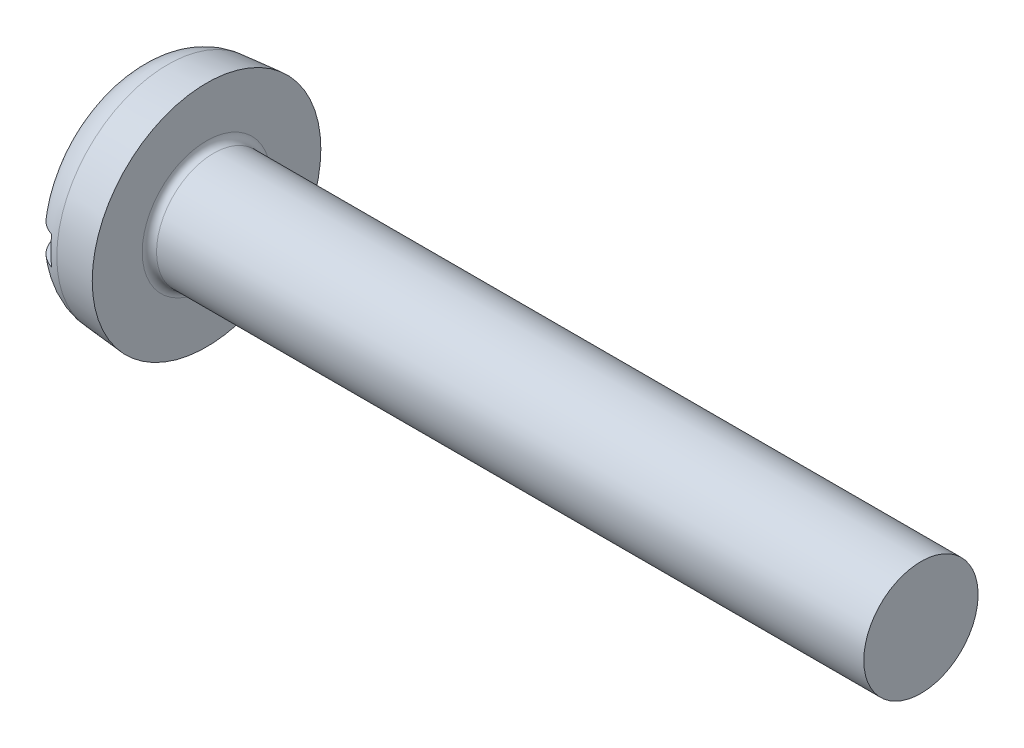
ISO-10303-21;
HEADER;
FILE_DESCRIPTION(('STEP AP214'),'2;1');
FILE_NAME('part.step','',(''),(''),'','','');
FILE_SCHEMA(('AUTOMOTIVE_DESIGN { 1 0 10303 214 1 1 1 1 }'));
ENDSEC;
DATA;
#1=APPLICATION_CONTEXT('core data for automotive mechanical design processes');
#2=APPLICATION_PROTOCOL_DEFINITION('international standard','automotive_design',2000,#1);
#3=PRODUCT_CONTEXT('',#1,'mechanical');
#4=PRODUCT('Part','Part','',(#3));
#5=PRODUCT_RELATED_PRODUCT_CATEGORY('part','',(#4));
#6=PRODUCT_DEFINITION_FORMATION('','',#4);
#7=PRODUCT_DEFINITION_CONTEXT('part definition',#1,'design');
#8=PRODUCT_DEFINITION('design','',#6,#7);
#9=PRODUCT_DEFINITION_SHAPE('','',#8);
#10=(LENGTH_UNIT() NAMED_UNIT(*) SI_UNIT(.MILLI.,.METRE.));
#11=(NAMED_UNIT(*) PLANE_ANGLE_UNIT() SI_UNIT($,.RADIAN.));
#12=(NAMED_UNIT(*) SI_UNIT($,.STERADIAN.) SOLID_ANGLE_UNIT());
#13=UNCERTAINTY_MEASURE_WITH_UNIT(LENGTH_MEASURE(1.E-05),#10,'distance_accuracy_value','');
#14=(GEOMETRIC_REPRESENTATION_CONTEXT(3) GLOBAL_UNCERTAINTY_ASSIGNED_CONTEXT((#13)) GLOBAL_UNIT_ASSIGNED_CONTEXT((#10,
#11,#12)) REPRESENTATION_CONTEXT('',''));
#15=CARTESIAN_POINT('',(0.,0.,0.));
#16=DIRECTION('',(0.,0.,1.));
#17=DIRECTION('',(1.,0.,0.));
#18=AXIS2_PLACEMENT_3D('',#15,#16,#17);
#19=CARTESIAN_POINT('',(0.,0.,0.));
#20=DIRECTION('',(1.,0.,0.));
#21=DIRECTION('',(0.,0.,-1.));
#22=AXIS2_PLACEMENT_3D('',#19,#20,#21);
#23=PLANE('',#22);
#24=DIRECTION('',(0.,0.,-1.));
#25=VECTOR('',#24,1.);
#26=CARTESIAN_POINT('',(0.,-0.2,1.6));
#27=LINE('',#26,#25);
#28=CARTESIAN_POINT('',(0.,-0.2,1.03520285906468));
#29=VERTEX_POINT('',#28);
#30=CARTESIAN_POINT('',(0.,-0.2,-1.03520285906468));
#31=VERTEX_POINT('',#30);
#32=EDGE_CURVE('E88',#29,#31,#27,.T.);
#33=ORIENTED_EDGE('',*,*,#32,.T.);
#34=CARTESIAN_POINT('',(0.,0.,0.));
#35=DIRECTION('',(1.,0.,0.));
#36=DIRECTION('',(0.,0.,-1.));
#37=AXIS2_PLACEMENT_3D('',#34,#35,#36);
#38=CIRCLE('',#37,1.05434574946537);
#39=EDGE_CURVE('E97',#31,#29,#38,.F.);
#40=ORIENTED_EDGE('',*,*,#39,.T.);
#41=EDGE_LOOP('',(#33,#40));
#42=FACE_BOUND('',#41,.T.);
#43=ADVANCED_FACE('F34',(#42),#23,.F.);
#44=DIRECTION('',(0.,0.,1.));
#45=VECTOR('',#44,1.);
#46=CARTESIAN_POINT('',(0.,0.2,1.6));
#47=LINE('',#46,#45);
#48=CARTESIAN_POINT('',(0.,0.2,-1.03520285906468));
#49=VERTEX_POINT('',#48);
#50=CARTESIAN_POINT('',(0.,0.2,1.03520285906468));
#51=VERTEX_POINT('',#50);
#52=EDGE_CURVE('E78',#49,#51,#47,.T.);
#53=ORIENTED_EDGE('',*,*,#52,.T.);
#54=EDGE_CURVE('E91',#51,#49,#38,.F.);
#55=ORIENTED_EDGE('',*,*,#54,.T.);
#56=EDGE_LOOP('',(#53,#55));
#57=FACE_BOUND('',#56,.T.);
#58=ADVANCED_FACE('F96',(#57),#23,.F.);
#59=CARTESIAN_POINT('',(0.5,0.,0.));
#60=DIRECTION('',(1.,0.,0.));
#61=DIRECTION('',(0.,0.,-1.));
#62=AXIS2_PLACEMENT_3D('',#59,#60,#61);
#63=TOROIDAL_SURFACE('',#62,1.05434574946537,0.5);
#64=CARTESIAN_POINT('',(0.456422128626174,0.,0.));
#65=DIRECTION('',(-1.,0.,0.));
#66=DIRECTION('',(0.,0.,1.));
#67=AXIS2_PLACEMENT_3D('',#64,#65,#66);
#68=CIRCLE('',#67,1.55244309851124);
#69=CARTESIAN_POINT('',(0.456422128626174,0.,1.55244309851124));
#70=VERTEX_POINT('',#69);
#71=EDGE_CURVE('E101',#70,#70,#68,.F.);
#72=ORIENTED_EDGE('',*,*,#71,.F.);
#73=EDGE_LOOP('',(#72));
#74=FACE_BOUND('',#73,.T.);
#75=CARTESIAN_POINT('',(0.35,0.,0.));
#76=DIRECTION('',(1.,0.,0.));
#77=DIRECTION('',(0.,0.,-1.));
#78=AXIS2_PLACEMENT_3D('',#75,#76,#77);
#79=CIRCLE('',#78,1.53131535017384);
#80=CARTESIAN_POINT('',(0.35,-0.2,1.51819850536023));
#81=VERTEX_POINT('',#80);
#82=CARTESIAN_POINT('',(0.35,0.2,1.51819850536023));
#83=VERTEX_POINT('',#82);
#84=EDGE_CURVE('E59',#81,#83,#79,.F.);
#85=ORIENTED_EDGE('',*,*,#84,.F.);
#86=CARTESIAN_POINT('',(0.176812245338107,-0.2,0.642423775290453));
#87=CARTESIAN_POINT('',(0.197656391566618,-0.2,0.623931058161206));
#88=CARTESIAN_POINT('',(0.220003811754387,-0.2,0.60711059755015));
#89=CARTESIAN_POINT('',(0.267180100797294,-0.2,0.577365047702586));
#90=CARTESIAN_POINT('',(0.292010734456332,-0.2,0.56444275544414));
#91=CARTESIAN_POINT('',(0.343577899023084,-0.2,0.54298514731887));
#92=CARTESIAN_POINT('',(0.370318610468389,-0.2,0.534459812106721));
#93=CARTESIAN_POINT('',(0.424877232699484,-0.2,0.522255893957642));
#94=CARTESIAN_POINT('',(0.452694536220812,-0.2,0.518574618533704));
#95=CARTESIAN_POINT('',(0.507347436456694,-0.2,0.516300652750354));
#96=CARTESIAN_POINT('',(0.534174457413182,-0.2,0.517498162918853));
#97=CARTESIAN_POINT('',(0.587230302886451,-0.2,0.524448740072296));
#98=CARTESIAN_POINT('',(0.613459093306604,-0.2,0.530202066055389));
#99=CARTESIAN_POINT('',(0.664260657505059,-0.2,0.545888682290317));
#100=CARTESIAN_POINT('',(0.688850242352041,-0.2,0.555767914890478));
#101=CARTESIAN_POINT('',(0.736143593168967,-0.2,0.579309540129046));
#102=CARTESIAN_POINT('',(0.758846941478747,-0.2,0.592972767752092));
#103=CARTESIAN_POINT('',(0.80300214925304,-0.2,0.624449004423594));
#104=CARTESIAN_POINT('',(0.824325241599833,-0.2,0.642442581537578));
#105=CARTESIAN_POINT('',(0.863838792989559,-0.2,0.681591476361998));
#106=CARTESIAN_POINT('',(0.882028505825669,-0.2,0.702747544977859));
#107=CARTESIAN_POINT('',(0.915707701545328,-0.2,0.748831682837765));
#108=CARTESIAN_POINT('',(0.931007353951228,-0.2,0.773898769970752));
#109=CARTESIAN_POINT('',(0.957255163391442,-0.2,0.826217807423051));
#110=CARTESIAN_POINT('',(0.968202858285346,-0.2,0.85346998941156));
#111=CARTESIAN_POINT('',(0.985551351159771,-0.2,0.909833347099575));
#112=CARTESIAN_POINT('',(0.991882119167744,-0.2,0.938966139449403));
#113=CARTESIAN_POINT('',(0.999504543382141,-0.2,0.997884971759479));
#114=CARTESIAN_POINT('',(1.00079638965494,-0.2,1.02767098703776));
#115=CARTESIAN_POINT('',(0.998270807715911,-0.2,1.08670057973591));
#116=CARTESIAN_POINT('',(0.994509106386988,-0.2,1.11594652682857));
#117=CARTESIAN_POINT('',(0.98203838488836,-0.2,1.1733647846461));
#118=CARTESIAN_POINT('',(0.973329806868563,-0.2,1.2015371910835));
#119=CARTESIAN_POINT('',(0.951381229972231,-0.2,1.25547754006911));
#120=CARTESIAN_POINT('',(0.938224017100542,-0.2,1.28127917230233));
#121=CARTESIAN_POINT('',(0.907700193056588,-0.2,1.3302597667873));
#122=CARTESIAN_POINT('',(0.890333940077135,-0.2,1.3534389519654));
#123=CARTESIAN_POINT('',(0.852175258318489,-0.2,1.39614558195128));
#124=CARTESIAN_POINT('',(0.83143906611353,-0.2,1.41572328696191));
#125=CARTESIAN_POINT('',(0.786943706790342,-0.2,1.45107407519974));
#126=CARTESIAN_POINT('',(0.763184726605644,-0.2,1.46684739352114));
#127=CARTESIAN_POINT('',(0.713591926333195,-0.2,1.49397124782911));
#128=CARTESIAN_POINT('',(0.687782778867003,-0.2,1.5053669084919));
#129=CARTESIAN_POINT('',(0.634610077870329,-0.2,1.52363335073435));
#130=CARTESIAN_POINT('',(0.607246584142756,-0.2,1.53050430627249));
#131=CARTESIAN_POINT('',(0.551920857622791,-0.2,1.53948979359233));
#132=CARTESIAN_POINT('',(0.523963277706672,-0.2,1.54163299551716));
#133=CARTESIAN_POINT('',(0.468086326713312,-0.2,1.54118492593323));
#134=CARTESIAN_POINT('',(0.440166954979163,-0.2,1.53859373687224));
#135=CARTESIAN_POINT('',(0.385217043681329,-0.2,1.52876323513847));
#136=CARTESIAN_POINT('',(0.358184838753279,-0.2,1.5215332253464));
#137=CARTESIAN_POINT('',(0.305714751463573,-0.2,1.50264566880826));
#138=CARTESIAN_POINT('',(0.280276869405811,-0.2,1.49098812121826));
#139=CARTESIAN_POINT('',(0.231662744367999,-0.2,1.4635592872359));
#140=CARTESIAN_POINT('',(0.208490831702471,-0.2,1.4477803280295));
#141=CARTESIAN_POINT('',(0.165105790935979,-0.2,1.41257713122551));
#142=CARTESIAN_POINT('',(0.144892723015595,-0.2,1.39315281950265));
#143=CARTESIAN_POINT('',(0.107866474694935,-0.2,1.35109338309972));
#144=CARTESIAN_POINT('',(0.0910739608161839,-0.2,1.32844006983289));
#145=CARTESIAN_POINT('',(0.0614863187518131,-0.2,1.28065921570801));
#146=CARTESIAN_POINT('',(0.048691364453578,-0.2,1.25553156728288));
#147=CARTESIAN_POINT('',(0.0273148341415869,-0.2,1.20324342811195));
#148=CARTESIAN_POINT('',(0.0187777691661438,-0.2,1.17606474761039));
#149=CARTESIAN_POINT('',(0.00631625826477537,-0.2,1.12067195571522));
#150=CARTESIAN_POINT('',(0.00239193428353257,-0.2,1.09245781696807));
#151=CARTESIAN_POINT('',(-0.000800718171925815,-0.2,1.03535487540871));
#152=CARTESIAN_POINT('',(-2.5416709378994E-07,-0.2,1.00646223595316));
#153=CARTESIAN_POINT('',(0.00635345942686731,-0.2,0.949197931620801));
#154=CARTESIAN_POINT('',(0.0119082056813898,-0.2,0.920826433674445));
#155=CARTESIAN_POINT('',(0.0277231669345139,-0.2,0.864879673195367));
#156=CARTESIAN_POINT('',(0.0380658160723156,-0.2,0.837327748177697));
#157=CARTESIAN_POINT('',(0.0631658487432307,-0.2,0.784336207465036));
#158=CARTESIAN_POINT('',(0.0779192415941305,-0.2,0.758894708801058));
#159=CARTESIAN_POINT('',(0.106480616423256,-0.2,0.71790872790465));
#160=CARTESIAN_POINT('',(0.119286907445075,-0.2,0.701656482649834));
#161=CARTESIAN_POINT('',(0.146723967323771,-0.2,0.670770861761563));
#162=CARTESIAN_POINT('',(0.16135475646474,-0.2,0.656137504129712));
#163=CARTESIAN_POINT('',(0.176812245338107,-0.2,0.642423775290453));
#164=B_SPLINE_CURVE_WITH_KNOTS('',3,(#86,#87,#88,#89,#90,#91,#92,#93,#94,#95,#96,#97,#98,#99,
#100,#101,#102,#103,#104,#105,#106,#107,#108,#109,#110,#111,#112,#113,#114,#115,#116,#117,#118,
#119,#120,#121,#122,#123,#124,#125,#126,#127,#128,#129,#130,#131,#132,#133,#134,#135,#136,#137,
#138,#139,#140,#141,#142,#143,#144,#145,#146,#147,#148,#149,#150,#151,#152,#153,#154,#155,#156,
#157,#158,#159,#160,#161,#162,#163),.UNSPECIFIED.,.T.,.F.,(4,2,2,2,2,2,2,2,2,2,2,2,2,2,2,2,2,2,
2,2,2,2,2,2,2,2,2,2,2,2,2,2,2,2,2,2,2,2,4),(0.,0.0835254361813604,0.16711066099808,
0.250884790042371,0.334612334986441,0.414778234839672,0.494948692451877,0.57410016705588,
0.65326912133305,0.736605061008668,0.819960819583615,0.907655316034343,0.995359122399358,
1.08436702847711,1.17337157717508,1.26140266077387,1.3494258774265,1.43589378334721,
1.52235433335935,1.60749748228452,1.69263536839262,1.77687047067773,1.86110233424006,
1.94482197647998,2.02854016078533,2.11209097577706,2.19564180669433,2.2793493064507,
2.36305850851542,2.44725937592745,2.53146390543144,2.61653114832757,2.70160064005245,
2.78791176181946,2.87425006464032,2.96213355572928,3.04993777240123,3.11187742352654,
3.17381776333526),.UNSPECIFIED.);
#165=EDGE_CURVE('E11',#81,#29,#164,.T.);
#166=ORIENTED_EDGE('',*,*,#165,.T.);
#167=ORIENTED_EDGE('',*,*,#39,.F.);
#168=CARTESIAN_POINT('',(0.209021499817963,-0.2,-1.44720111123624));
#169=CARTESIAN_POINT('',(0.231659941137034,-0.2,-1.46355413178782));
#170=CARTESIAN_POINT('',(0.255689818432294,-0.2,-1.47801452215844));
#171=CARTESIAN_POINT('',(0.305854576840009,-0.2,-1.50271047561212));
#172=CARTESIAN_POINT('',(0.331991818036317,-0.2,-1.51294122102487));
#173=CARTESIAN_POINT('',(0.385609226558411,-0.2,-1.52885984689101));
#174=CARTESIAN_POINT('',(0.413088983400637,-0.2,-1.53454910682393));
#175=CARTESIAN_POINT('',(0.468607080189714,-0.2,-1.54121911450825));
#176=CARTESIAN_POINT('',(0.496645285397363,-0.2,-1.5422009845377));
#177=CARTESIAN_POINT('',(0.552422799879022,-0.2,-1.53943414375897));
#178=CARTESIAN_POINT('',(0.58016264630378,-0.2,-1.53569625291145));
#179=CARTESIAN_POINT('',(0.63462205163315,-0.2,-1.52361782833393));
#180=CARTESIAN_POINT('',(0.661341580362917,-0.2,-1.51527715859405));
#181=CARTESIAN_POINT('',(0.713015340417279,-0.2,-1.49423300399112));
#182=CARTESIAN_POINT('',(0.737968862468665,-0.2,-1.48152777806942));
#183=CARTESIAN_POINT('',(0.785400549169818,-0.2,-1.4521254422675));
#184=CARTESIAN_POINT('',(0.80787868713526,-0.2,-1.43542828936097));
#185=CARTESIAN_POINT('',(0.849830735809496,-0.2,-1.39844426212838));
#186=CARTESIAN_POINT('',(0.869291207245726,-0.2,-1.37814214710056));
#187=CARTESIAN_POINT('',(0.904561335625627,-0.2,-1.33458309765223));
#188=CARTESIAN_POINT('',(0.920370882948668,-0.2,-1.31132607454177));
#189=CARTESIAN_POINT('',(0.948041611981333,-0.2,-1.26230898150754));
#190=CARTESIAN_POINT('',(0.959867913540936,-0.2,-1.23652922769644));
#191=CARTESIAN_POINT('',(0.979086311587476,-0.2,-1.18336789465759));
#192=CARTESIAN_POINT('',(0.986478161888597,-0.2,-1.15598622658955));
#193=CARTESIAN_POINT('',(0.99672785731409,-0.2,-1.10001821282817));
#194=CARTESIAN_POINT('',(0.999525279964551,-0.2,-1.07142080979166));
#195=CARTESIAN_POINT('',(1.00036372618921,-0.2,-1.01415726923613));
#196=CARTESIAN_POINT('',(0.998404352361653,-0.2,-0.985491126174174));
#197=CARTESIAN_POINT('',(0.989750739478325,-0.2,-0.928387976774158));
#198=CARTESIAN_POINT('',(0.982977192562942,-0.2,-0.899962991274055));
#199=CARTESIAN_POINT('',(0.964831586002546,-0.2,-0.844620277351311));
#200=CARTESIAN_POINT('',(0.953459026982048,-0.2,-0.817702712970763));
#201=CARTESIAN_POINT('',(0.926225110228056,-0.2,-0.765686979411013));
#202=CARTESIAN_POINT('',(0.910294465011483,-0.2,-0.740625057453279));
#203=CARTESIAN_POINT('',(0.874457300896757,-0.2,-0.693518438058254));
#204=CARTESIAN_POINT('',(0.854550196620212,-0.2,-0.671474185661206));
#205=CARTESIAN_POINT('',(0.811255618971962,-0.2,-0.631056919127048));
#206=CARTESIAN_POINT('',(0.787864253123593,-0.2,-0.612688065476465));
#207=CARTESIAN_POINT('',(0.738233909696237,-0.2,-0.580307105618137));
#208=CARTESIAN_POINT('',(0.711995600088768,-0.2,-0.566293980405587));
#209=CARTESIAN_POINT('',(0.658411786813969,-0.2,-0.543651385401974));
#210=CARTESIAN_POINT('',(0.631141694080634,-0.2,-0.534844020067332));
#211=CARTESIAN_POINT('',(0.575466809457536,-0.2,-0.522277216417842));
#212=CARTESIAN_POINT('',(0.547062680323904,-0.2,-0.518514872892671));
#213=CARTESIAN_POINT('',(0.491811130755031,-0.2,-0.51631366663304));
#214=CARTESIAN_POINT('',(0.464975808680366,-0.2,-0.517560628331812));
#215=CARTESIAN_POINT('',(0.411912730039869,-0.2,-0.524611466360407));
#216=CARTESIAN_POINT('',(0.385684979086227,-0.2,-0.530415384765987));
#217=CARTESIAN_POINT('',(0.334899460639686,-0.2,-0.546200096419528));
#218=CARTESIAN_POINT('',(0.310324494902056,-0.2,-0.556125954908874));
#219=CARTESIAN_POINT('',(0.263066985791903,-0.2,-0.579757130410152));
#220=CARTESIAN_POINT('',(0.240384867383554,-0.2,-0.593463293182606));
#221=CARTESIAN_POINT('',(0.196274896338125,-0.2,-0.625026521494854));
#222=CARTESIAN_POINT('',(0.174976657079979,-0.2,-0.64306465816181));
#223=CARTESIAN_POINT('',(0.135520080739938,-0.2,-0.682298711868883));
#224=CARTESIAN_POINT('',(0.117362499668052,-0.2,-0.703495386943611));
#225=CARTESIAN_POINT('',(0.0837592681235483,-0.2,-0.749654011599367));
#226=CARTESIAN_POINT('',(0.0685031891950623,-0.2,-0.774754253687461));
#227=CARTESIAN_POINT('',(0.0423483754092362,-0.2,-0.827132358691851));
#228=CARTESIAN_POINT('',(0.0314501021941616,-0.2,-0.854410451950864));
#229=CARTESIAN_POINT('',(0.014207692602473,-0.2,-0.910812498375582));
#230=CARTESIAN_POINT('',(0.00793278552302624,-0.2,-0.939957675835885));
#231=CARTESIAN_POINT('',(0.000424133912273648,-0.2,-0.998890534246523));
#232=CARTESIAN_POINT('',(-0.000809998106316274,-0.2,-1.02867816563409));
#233=CARTESIAN_POINT('',(0.00182976001452002,-0.2,-1.08769522731211));
#234=CARTESIAN_POINT('',(0.00564696083815947,-0.2,-1.11692718058952));
#235=CARTESIAN_POINT('',(0.0182271077139672,-0.2,-1.17431618737652));
#236=CARTESIAN_POINT('',(0.0269908664196951,-0.2,-1.20247306345355));
#237=CARTESIAN_POINT('',(0.0490488696622139,-0.2,-1.25638422396362));
#238=CARTESIAN_POINT('',(0.0622626440844576,-0.2,-1.28217148911756));
#239=CARTESIAN_POINT('',(0.0928885063417043,-0.2,-1.33108922347451));
#240=CARTESIAN_POINT('',(0.110295035205786,-0.2,-1.35422315115333));
#241=CARTESIAN_POINT('',(0.141464530020152,-0.2,-1.38897530161554));
#242=CARTESIAN_POINT('',(0.154095408523145,-0.2,-1.40162696556315));
#243=CARTESIAN_POINT('',(0.180635004655154,-0.2,-1.42551080352041));
#244=CARTESIAN_POINT('',(0.194543711375822,-0.2,-1.43674298964568));
#245=CARTESIAN_POINT('',(0.209021499817963,-0.2,-1.44720111123624));
#246=B_SPLINE_CURVE_WITH_KNOTS('',3,(#168,#169,#170,#171,#172,#173,#174,#175,#176,#177,#178,
#179,#180,#181,#182,#183,#184,#185,#186,#187,#188,#189,#190,#191,#192,#193,#194,#195,#196,#197,
#198,#199,#200,#201,#202,#203,#204,#205,#206,#207,#208,#209,#210,#211,#212,#213,#214,#215,#216,
#217,#218,#219,#220,#221,#222,#223,#224,#225,#226,#227,#228,#229,#230,#231,#232,#233,#234,#235,
#236,#237,#238,#239,#240,#241,#242,#243,#244,#245),.UNSPECIFIED.,.T.,.F.,(4,2,2,2,2,2,2,2,2,2,2,
2,2,2,2,2,2,2,2,2,2,2,2,2,2,2,2,2,2,2,2,2,2,2,2,2,2,2,4),(0.,0.0837163073778265,
0.16752770872243,0.251313642594852,0.33507960026062,0.41865387426646,0.502230617984072,
0.585840739966371,0.669451763166922,0.753425071135857,0.837400900113229,0.922094043758889,
1.00679188884794,1.09259494864017,1.17840517700883,1.26566280916234,1.35292991857455,
1.44160130250583,1.53028574947026,1.61907002468243,1.70783351351733,1.79335589110469,
1.87882899886573,1.95902771878604,2.03922717921404,2.11839044948203,2.19757144518957,
2.28093653847568,2.36432167131851,2.45203291249448,2.53975344286284,2.62876217789799,
2.71776407065159,2.80577554910371,2.8938014908795,2.98031424109074,3.06671291354612,
3.1202518173976,3.17379026424961),.UNSPECIFIED.);
#247=CARTESIAN_POINT('',(0.35,-0.2,-1.51819850536023));
#248=VERTEX_POINT('',#247);
#249=EDGE_CURVE('E94',#31,#248,#246,.T.);
#250=ORIENTED_EDGE('',*,*,#249,.T.);
#251=CARTESIAN_POINT('',(0.35,0.2,-1.51819850536023));
#252=VERTEX_POINT('',#251);
#253=EDGE_CURVE('E93',#252,#248,#79,.F.);
#254=ORIENTED_EDGE('',*,*,#253,.F.);
#255=CARTESIAN_POINT('',(0.209021499817963,0.2,-1.44720111123624));
#256=CARTESIAN_POINT('',(0.186122748418178,0.2,-1.43065687892588));
#257=CARTESIAN_POINT('',(0.164613802448487,0.2,-1.4121511504845));
#258=CARTESIAN_POINT('',(0.125002122817551,0.2,-1.37176488184653));
#259=CARTESIAN_POINT('',(0.106903917106941,0.2,-1.34987992464309));
#260=CARTESIAN_POINT('',(0.0746460841806091,0.2,-1.30340745333834));
#261=CARTESIAN_POINT('',(0.0604827083892179,0.2,-1.27882254276704));
#262=CARTESIAN_POINT('',(0.036448363795442,0.2,-1.2276478824117));
#263=CARTESIAN_POINT('',(0.0265763120603446,0.2,-1.20105864041839));
#264=CARTESIAN_POINT('',(0.0112893070274943,0.2,-1.14637257569652));
#265=CARTESIAN_POINT('',(0.00591501269441763,0.2,-1.11826439507127));
#266=CARTESIAN_POINT('',(-0.000118395359281445,0.2,-1.06154626587441));
#267=CARTESIAN_POINT('',(-0.000776960929562763,0.2,-1.03293625935864));
#268=CARTESIAN_POINT('',(0.00262524324847143,0.2,-0.975538416063039));
#269=CARTESIAN_POINT('',(0.00676182225957507,0.2,-0.946755078615845));
#270=CARTESIAN_POINT('',(0.0197241520147936,0.2,-0.890264626387201));
#271=CARTESIAN_POINT('',(0.028550364282093,0.2,-0.86255761781908));
#272=CARTESIAN_POINT('',(0.050814282720423,0.2,-0.808503040390445));
#273=CARTESIAN_POINT('',(0.0643286710101671,0.2,-0.782187037620907));
#274=CARTESIAN_POINT('',(0.0955507531013224,0.2,-0.732167625966489));
#275=CARTESIAN_POINT('',(0.113259054895109,0.2,-0.708464596615636));
#276=CARTESIAN_POINT('',(0.152545834900341,0.2,-0.664194658393632));
#277=CARTESIAN_POINT('',(0.174152071647115,0.2,-0.643652340766474));
#278=CARTESIAN_POINT('',(0.220581625116487,0.2,-0.606587015041182));
#279=CARTESIAN_POINT('',(0.245404747447988,0.2,-0.590063764250893));
#280=CARTESIAN_POINT('',(0.296954326646332,0.2,-0.562026605789657));
#281=CARTESIAN_POINT('',(0.323619163754995,0.2,-0.550399768890511));
#282=CARTESIAN_POINT('',(0.378598982319635,0.2,-0.532119902089169));
#283=CARTESIAN_POINT('',(0.406912966682745,0.2,-0.525463899734449));
#284=CARTESIAN_POINT('',(0.462540441137298,0.2,-0.517724781964013));
#285=CARTESIAN_POINT('',(0.489810500422484,0.2,-0.516328232903135));
#286=CARTESIAN_POINT('',(0.544173553857568,0.2,-0.518310829708952));
#287=CARTESIAN_POINT('',(0.571266574738006,0.2,-0.521689237058418));
#288=CARTESIAN_POINT('',(0.623579103302408,0.2,-0.532854204126792));
#289=CARTESIAN_POINT('',(0.64883094468124,0.2,-0.540490929218408));
#290=CARTESIAN_POINT('',(0.697772455593545,0.2,-0.559732241203134));
#291=CARTESIAN_POINT('',(0.72146180198453,0.2,-0.571337645816025));
#292=CARTESIAN_POINT('',(0.767640471980269,0.2,-0.598638564928935));
#293=CARTESIAN_POINT('',(0.790043937207254,0.2,-0.614479068704));
#294=CARTESIAN_POINT('',(0.832065998844155,0.2,-0.649500289637889));
#295=CARTESIAN_POINT('',(0.851683909507113,0.2,-0.668681826712314));
#296=CARTESIAN_POINT('',(0.888752356518102,0.2,-0.711069507251305));
#297=CARTESIAN_POINT('',(0.906009129853732,0.2,-0.734445379999891));
#298=CARTESIAN_POINT('',(0.936469675553122,0.2,-0.783705044727341));
#299=CARTESIAN_POINT('',(0.949672830141508,0.2,-0.809589218183595));
#300=CARTESIAN_POINT('',(0.97193850057002,0.2,-0.863845707677468));
#301=CARTESIAN_POINT('',(0.980889021372485,0.2,-0.892264106083925));
#302=CARTESIAN_POINT('',(0.993860437115331,0.2,-0.950205978188057));
#303=CARTESIAN_POINT('',(0.997881369764178,0.2,-0.979729443430838));
#304=CARTESIAN_POINT('',(1.00082434300442,0.2,-1.03884993394592));
#305=CARTESIAN_POINT('',(0.999777497764573,0.2,-1.0684453981139));
#306=CARTESIAN_POINT('',(0.992639369498306,0.2,-1.12702257664223));
#307=CARTESIAN_POINT('',(0.986548509891841,0.2,-1.15600434231011));
#308=CARTESIAN_POINT('',(0.969607791248461,0.2,-1.21199828635369));
#309=CARTESIAN_POINT('',(0.958841535918028,0.2,-1.23903575728609));
#310=CARTESIAN_POINT('',(0.932848885604661,0.2,-1.29087503168137));
#311=CARTESIAN_POINT('',(0.917622880673421,0.2,-1.31567703041168));
#312=CARTESIAN_POINT('',(0.883415752591074,0.2,-1.36191456450718));
#313=CARTESIAN_POINT('',(0.864499859675285,0.2,-1.38339836938881));
#314=CARTESIAN_POINT('',(0.823290799290223,0.2,-1.42283763433665));
#315=CARTESIAN_POINT('',(0.800997856521277,0.2,-1.4407933289719));
#316=CARTESIAN_POINT('',(0.753955665849217,0.2,-1.47244698052649));
#317=CARTESIAN_POINT('',(0.729238701078552,0.2,-1.48619292864573));
#318=CARTESIAN_POINT('',(0.677836459862761,0.2,-1.50930448914476));
#319=CARTESIAN_POINT('',(0.651151351485749,0.2,-1.51867047504783));
#320=CARTESIAN_POINT('',(0.596781408850947,0.2,-1.53269216948401));
#321=CARTESIAN_POINT('',(0.569105381332732,0.2,-1.53738204892999));
#322=CARTESIAN_POINT('',(0.513351073329721,0.2,-1.54203383413956));
#323=CARTESIAN_POINT('',(0.485272699578506,0.2,-1.54199462534523));
#324=CARTESIAN_POINT('',(0.429598553005632,0.2,-1.53719466257797));
#325=CARTESIAN_POINT('',(0.402001724716619,0.2,-1.53244605213925));
#326=CARTESIAN_POINT('',(0.34802140224729,0.2,-1.51838664118811));
#327=CARTESIAN_POINT('',(0.321636430625271,0.2,-1.5090815663995));
#328=CARTESIAN_POINT('',(0.280891455620183,0.2,-1.4907390506325));
#329=CARTESIAN_POINT('',(0.265907224964648,0.2,-1.48305487086197));
#330=CARTESIAN_POINT('',(0.236791491627114,0.2,-1.46621276821471));
#331=CARTESIAN_POINT('',(0.222659986719118,0.2,-1.45705484918532));
#332=CARTESIAN_POINT('',(0.209021499817963,0.2,-1.44720111123624));
#333=B_SPLINE_CURVE_WITH_KNOTS('',3,(#255,#256,#257,#258,#259,#260,#261,#262,#263,#264,#265,
#266,#267,#268,#269,#270,#271,#272,#273,#274,#275,#276,#277,#278,#279,#280,#281,#282,#283,#284,
#285,#286,#287,#288,#289,#290,#291,#292,#293,#294,#295,#296,#297,#298,#299,#300,#301,#302,#303,
#304,#305,#306,#307,#308,#309,#310,#311,#312,#313,#314,#315,#316,#317,#318,#319,#320,#321,#322,
#323,#324,#325,#326,#327,#328,#329,#330,#331,#332),.UNSPECIFIED.,.T.,.F.,(4,2,2,2,2,2,2,2,2,2,2,
2,2,2,2,2,2,2,2,2,2,2,2,2,2,2,2,2,2,2,2,2,2,2,2,2,2,2,4),(0.,0.0846878562604972,
0.16948736044048,0.2542057998735,0.338902847842209,0.424357516871669,0.509822118882446,
0.59665652180578,0.683499471989195,0.771835628438137,0.860184598842491,0.949189529618495,
1.03818908447891,1.12500564078518,1.21177024099185,1.29327399482486,1.3747651442831,
1.45355500695188,1.5323611135343,1.61431830608254,1.69629563997531,1.78306560209964,
1.86984878149251,1.95880564503607,2.0477618281074,2.13617255026534,2.22457585153441,
2.31145955910979,2.39833567006514,2.48379618244436,2.56925101099358,2.65369189764631,
2.73812558186452,2.82193763799998,2.90576944711298,2.98938565038903,3.07289704884794,
3.12333723282884,3.17377728513259),.UNSPECIFIED.);
#334=EDGE_CURVE('E81',#252,#49,#333,.T.);
#335=ORIENTED_EDGE('',*,*,#334,.T.);
#336=ORIENTED_EDGE('',*,*,#54,.F.);
#337=CARTESIAN_POINT('',(0.176812245338107,0.2,0.642423775290453));
#338=CARTESIAN_POINT('',(0.154702612307566,0.2,0.662041585192784));
#339=CARTESIAN_POINT('',(0.134253297161551,0.2,0.683570248770686));
#340=CARTESIAN_POINT('',(0.0972327579800651,0.2,0.729775132087801));
#341=CARTESIAN_POINT('',(0.0806680483139025,0.2,0.754456533338217));
#342=CARTESIAN_POINT('',(0.0519072561458678,0.2,0.806221960091407));
#343=CARTESIAN_POINT('',(0.0397074393427585,0.2,0.833303906979416));
#344=CARTESIAN_POINT('',(0.0200236232864329,0.2,0.889118714678711));
#345=CARTESIAN_POINT('',(0.0125376920736548,0.2,0.917850893876098));
#346=CARTESIAN_POINT('',(0.00251353684755951,0.2,0.976217683148632));
#347=CARTESIAN_POINT('',(-1.64442575971383E-05,0.2,1.00585371355919));
#348=CARTESIAN_POINT('',(1.660336020252E-05,0.2,1.06512652692138));
#349=CARTESIAN_POINT('',(0.0025797007250253,0.2,1.09476330987779));
#350=CARTESIAN_POINT('',(0.0126917533382927,0.2,1.1527074778913));
#351=CARTESIAN_POINT('',(0.0201638959754931,0.2,1.18102825913155));
#352=CARTESIAN_POINT('',(0.0398408409860865,0.2,1.2359754802176));
#353=CARTESIAN_POINT('',(0.052045164741138,0.2,1.26260209109683));
#354=CARTESIAN_POINT('',(0.0806073130285885,0.2,1.31291602673095));
#355=CARTESIAN_POINT('',(0.096889570250369,0.2,1.33664625812301));
#356=CARTESIAN_POINT('',(0.133257839056494,0.2,1.38098733360306));
#357=CARTESIAN_POINT('',(0.153343553406196,0.2,1.40159842122129));
#358=CARTESIAN_POINT('',(0.196451203328785,0.2,1.43882523867761));
#359=CARTESIAN_POINT('',(0.219429674182238,0.2,1.45549131261206));
#360=CARTESIAN_POINT('',(0.267878667804024,0.2,1.48468852159065));
#361=CARTESIAN_POINT('',(0.29334906231439,0.2,1.49721986930193));
#362=CARTESIAN_POINT('',(0.345815128829971,0.2,1.517681912311));
#363=CARTESIAN_POINT('',(0.372795327070425,0.2,1.52565229791238));
#364=CARTESIAN_POINT('',(0.427713479707295,0.2,1.53692751254217));
#365=CARTESIAN_POINT('',(0.455651404638832,0.2,1.54023248497235));
#366=CARTESIAN_POINT('',(0.511557840216113,0.2,1.54207504417347));
#367=CARTESIAN_POINT('',(0.539525649691556,0.2,1.54063398012742));
#368=CARTESIAN_POINT('',(0.594821363561877,0.2,1.53307394104472));
#369=CARTESIAN_POINT('',(0.622149274572843,0.2,1.52695501439584));
#370=CARTESIAN_POINT('',(0.675376478271587,0.2,1.51022327849377));
#371=CARTESIAN_POINT('',(0.701276516642559,0.2,1.49961284047348));
#372=CARTESIAN_POINT('',(0.75093561314924,0.2,1.47420824530533));
#373=CARTESIAN_POINT('',(0.774694654695416,0.2,1.45941405574331));
#374=CARTESIAN_POINT('',(0.81948713768951,0.2,1.42601464842765));
#375=CARTESIAN_POINT('',(0.840511160782152,0.2,1.4073968027913));
#376=CARTESIAN_POINT('',(0.879162866353836,0.2,1.36691918237975));
#377=CARTESIAN_POINT('',(0.896790457324499,0.2,1.34505932028461));
#378=CARTESIAN_POINT('',(0.928296276700786,0.2,1.29854787388724));
#379=CARTESIAN_POINT('',(0.942145481911512,0.2,1.27387663567349));
#380=CARTESIAN_POINT('',(0.96556015148179,0.2,1.22258005393831));
#381=CARTESIAN_POINT('',(0.975125409575014,0.2,1.19595461639662));
#382=CARTESIAN_POINT('',(0.989830044230755,0.2,1.14116777091254));
#383=CARTESIAN_POINT('',(0.994915183325904,0.2,1.11299181373593));
#384=CARTESIAN_POINT('',(1.00036331847097,0.2,1.05618799558154));
#385=CARTESIAN_POINT('',(1.00072594918917,0.2,1.02756009981346));
#386=CARTESIAN_POINT('',(0.996728541355129,0.2,0.970172137882069));
#387=CARTESIAN_POINT('',(0.992292215789273,0.2,0.94141739080394));
#388=CARTESIAN_POINT('',(0.978738893833073,0.2,0.885033177627242));
#389=CARTESIAN_POINT('',(0.969621429784219,0.2,0.857403824256296));
#390=CARTESIAN_POINT('',(0.946786518376836,0.2,0.803555744981821));
#391=CARTESIAN_POINT('',(0.932993027302192,0.2,0.777369247398891));
#392=CARTESIAN_POINT('',(0.901235552715303,0.2,0.727655106507432));
#393=CARTESIAN_POINT('',(0.883270945770643,0.2,0.704127861444236));
#394=CARTESIAN_POINT('',(0.843510715272407,0.2,0.660269585851971));
#395=CARTESIAN_POINT('',(0.821689860961846,0.2,0.639961387802404));
#396=CARTESIAN_POINT('',(0.774870470566997,0.2,0.603404198864382));
#397=CARTESIAN_POINT('',(0.749872173965663,0.2,0.587154902331035));
#398=CARTESIAN_POINT('',(0.698057628210499,0.2,0.559713743668727));
#399=CARTESIAN_POINT('',(0.67130506015674,0.2,0.548402028597039));
#400=CARTESIAN_POINT('',(0.616208466179295,0.2,0.530766704780981));
#401=CARTESIAN_POINT('',(0.587865482480596,0.2,0.524439869329189));
#402=CARTESIAN_POINT('',(0.532256981834866,0.2,0.517338275648888));
#403=CARTESIAN_POINT('',(0.505031591859407,0.2,0.516247604966099));
#404=CARTESIAN_POINT('',(0.450800919779457,0.2,0.51881840620372));
#405=CARTESIAN_POINT('',(0.423795667458098,0.2,0.522480510746838));
#406=CARTESIAN_POINT('',(0.371631393142635,0.2,0.534183158459805));
#407=CARTESIAN_POINT('',(0.346441169120207,0.2,0.542086434018939));
#408=CARTESIAN_POINT('',(0.297683954206149,0.2,0.561836906568107));
#409=CARTESIAN_POINT('',(0.274115374435307,0.2,0.573680174801032));
#410=CARTESIAN_POINT('',(0.238350445927476,0.2,0.595303011811938));
#411=CARTESIAN_POINT('',(0.225448951820626,0.2,0.603942086476779));
#412=CARTESIAN_POINT('',(0.200483216576452,0.2,0.622353186457715));
#413=CARTESIAN_POINT('',(0.188418951937857,0.2,0.632125179951874));
#414=CARTESIAN_POINT('',(0.176812245338107,0.2,0.642423775290453));
#415=B_SPLINE_CURVE_WITH_KNOTS('',3,(#337,#338,#339,#340,#341,#342,#343,#344,#345,#346,#347,
#348,#349,#350,#351,#352,#353,#354,#355,#356,#357,#358,#359,#360,#361,#362,#363,#364,#365,#366,
#367,#368,#369,#370,#371,#372,#373,#374,#375,#376,#377,#378,#379,#380,#381,#382,#383,#384,#385,
#386,#387,#388,#389,#390,#391,#392,#393,#394,#395,#396,#397,#398,#399,#400,#401,#402,#403,#404,
#405,#406,#407,#408,#409,#410,#411,#412,#413,#414),.UNSPECIFIED.,.T.,.F.,(4,2,2,2,2,2,2,2,2,2,2,
2,2,2,2,2,2,2,2,2,2,2,2,2,2,2,2,2,2,2,2,2,2,2,2,2,2,2,4),(0.,0.0886172824475866,
0.17738212743566,0.266070848724324,0.354723197739845,0.443522871641906,0.53232374234797,
0.619767204878502,0.707201825580768,0.79312269780187,0.879036858200784,0.963787100566757,
1.04853298317591,1.13252971593854,1.21652386682017,1.30014070224384,1.38375667274753,
1.46732855427333,1.55090108330091,1.63475418745175,1.71860955049923,1.80309197806349,
1.88757847290652,1.97307425899342,2.0585766589675,2.14545850179557,2.23234902604625,
2.32072639222391,2.40911697616501,2.49810887551969,2.58709407155213,2.67377949802358,
2.76040876690365,2.84173954987536,2.92308115956936,3.00193621963368,3.08071288401749,
3.12723485387296,3.17375551731479),.UNSPECIFIED.);
#416=EDGE_CURVE('E47',#51,#83,#415,.T.);
#417=ORIENTED_EDGE('',*,*,#416,.T.);
#418=EDGE_LOOP('',(#85,#166,#167,#250,#254,#335,#336,#417));
#419=FACE_BOUND('',#418,.T.);
#420=ADVANCED_FACE('F36',(#74,#419),#63,.T.);
#421=CARTESIAN_POINT('',(11.,0.8,0.));
#422=DIRECTION('',(-1.,0.,0.));
#423=DIRECTION('',(0.,0.,1.));
#424=AXIS2_PLACEMENT_3D('',#421,#422,#423);
#425=PLANE('',#424);
#426=CARTESIAN_POINT('',(11.,0.,0.));
#427=DIRECTION('',(-1.,0.,0.));
#428=DIRECTION('',(0.,0.,1.));
#429=AXIS2_PLACEMENT_3D('',#426,#427,#428);
#430=CIRCLE('',#429,0.8);
#431=CARTESIAN_POINT('',(11.,0.,0.8));
#432=VERTEX_POINT('',#431);
#433=EDGE_CURVE('E140',#432,#432,#430,.T.);
#434=ORIENTED_EDGE('',*,*,#433,.F.);
#435=EDGE_LOOP('',(#434));
#436=FACE_BOUND('',#435,.T.);
#437=ADVANCED_FACE('F169',(#436),#425,.F.);
#438=CARTESIAN_POINT('',(0.,0.,0.));
#439=DIRECTION('',(-1.,0.,0.));
#440=DIRECTION('',(0.,0.,1.));
#441=AXIS2_PLACEMENT_3D('',#438,#439,#440);
#442=CYLINDRICAL_SURFACE('',#441,0.8);
#443=CARTESIAN_POINT('',(1.1,0.,0.));
#444=DIRECTION('',(-1.,0.,0.));
#445=DIRECTION('',(0.,0.,1.));
#446=AXIS2_PLACEMENT_3D('',#443,#444,#445);
#447=CIRCLE('',#446,0.8);
#448=CARTESIAN_POINT('',(1.1,0.,0.8));
#449=VERTEX_POINT('',#448);
#450=EDGE_CURVE('E98',#449,#449,#447,.F.);
#451=ORIENTED_EDGE('',*,*,#450,.T.);
#452=EDGE_LOOP('',(#451));
#453=FACE_BOUND('',#452,.T.);
#454=ORIENTED_EDGE('',*,*,#433,.T.);
#455=EDGE_LOOP('',(#454));
#456=FACE_BOUND('',#455,.T.);
#457=ADVANCED_FACE('F167',(#453,#456),#442,.T.);
#458=CARTESIAN_POINT('',(1.,1.6,0.));
#459=DIRECTION('',(-1.,0.,0.));
#460=DIRECTION('',(0.,0.,1.));
#461=AXIS2_PLACEMENT_3D('',#458,#459,#460);
#462=PLANE('',#461);
#463=CARTESIAN_POINT('',(1.,0.,0.));
#464=DIRECTION('',(-1.,0.,0.));
#465=DIRECTION('',(0.,0.,1.));
#466=AXIS2_PLACEMENT_3D('',#463,#464,#465);
#467=CIRCLE('',#466,0.9);
#468=CARTESIAN_POINT('',(1.,0.,0.9));
#469=VERTEX_POINT('',#468);
#470=EDGE_CURVE('E103',#469,#469,#467,.T.);
#471=ORIENTED_EDGE('',*,*,#470,.T.);
#472=EDGE_LOOP('',(#471));
#473=FACE_BOUND('',#472,.T.);
#474=CARTESIAN_POINT('',(1.,0.,0.));
#475=DIRECTION('',(-1.,0.,0.));
#476=DIRECTION('',(0.,0.,1.));
#477=AXIS2_PLACEMENT_3D('',#474,#475,#476);
#478=CIRCLE('',#477,1.6);
#479=CARTESIAN_POINT('',(1.,0.,1.6));
#480=VERTEX_POINT('',#479);
#481=EDGE_CURVE('E137',#480,#480,#478,.T.);
#482=ORIENTED_EDGE('',*,*,#481,.F.);
#483=EDGE_LOOP('',(#482));
#484=FACE_BOUND('',#483,.T.);
#485=ADVANCED_FACE('F145',(#473,#484),#462,.F.);
#486=CARTESIAN_POINT('',(1.,0.,0.));
#487=DIRECTION('',(1.,0.,0.));
#488=DIRECTION('',(0.,0.,-1.));
#489=AXIS2_PLACEMENT_3D('',#486,#487,#488);
#490=CONICAL_SURFACE('',#489,1.6,0.08726646259971);
#491=ORIENTED_EDGE('',*,*,#71,.T.);
#492=EDGE_LOOP('',(#491));
#493=FACE_BOUND('',#492,.T.);
#494=ORIENTED_EDGE('',*,*,#481,.T.);
#495=EDGE_LOOP('',(#494));
#496=FACE_BOUND('',#495,.T.);
#497=ADVANCED_FACE('F150',(#493,#496),#490,.T.);
#498=CARTESIAN_POINT('',(1.1,0.,0.));
#499=DIRECTION('',(-1.,0.,0.));
#500=DIRECTION('',(0.,0.,1.));
#501=AXIS2_PLACEMENT_3D('',#498,#499,#500);
#502=TOROIDAL_SURFACE('',#501,0.9,0.1);
#503=ORIENTED_EDGE('',*,*,#450,.F.);
#504=EDGE_LOOP('',(#503));
#505=FACE_BOUND('',#504,.T.);
#506=ORIENTED_EDGE('',*,*,#470,.F.);
#507=EDGE_LOOP('',(#506));
#508=FACE_BOUND('',#507,.T.);
#509=ADVANCED_FACE('F148',(#505,#508),#502,.F.);
#510=CARTESIAN_POINT('',(0.35,-0.2,1.6));
#511=DIRECTION('',(0.,1.,0.));
#512=DIRECTION('',(0.,0.,1.));
#513=AXIS2_PLACEMENT_3D('',#510,#511,#512);
#514=PLANE('',#513);
#515=ORIENTED_EDGE('',*,*,#32,.F.);
#516=ORIENTED_EDGE('',*,*,#165,.F.);
#517=DIRECTION('',(0.,0.,-1.));
#518=VECTOR('',#517,1.);
#519=CARTESIAN_POINT('',(0.35,-0.2,1.6));
#520=LINE('',#519,#518);
#521=EDGE_CURVE('E87',#81,#248,#520,.T.);
#522=ORIENTED_EDGE('',*,*,#521,.T.);
#523=ORIENTED_EDGE('',*,*,#249,.F.);
#524=EDGE_LOOP('',(#515,#516,#522,#523));
#525=FACE_BOUND('',#524,.T.);
#526=ADVANCED_FACE('F121',(#525),#514,.T.);
#527=CARTESIAN_POINT('',(0.35,0.2,1.6));
#528=DIRECTION('',(0.,-1.,0.));
#529=DIRECTION('',(0.,0.,-1.));
#530=AXIS2_PLACEMENT_3D('',#527,#528,#529);
#531=PLANE('',#530);
#532=DIRECTION('',(0.,0.,1.));
#533=VECTOR('',#532,1.);
#534=CARTESIAN_POINT('',(0.35,0.2,1.6));
#535=LINE('',#534,#533);
#536=EDGE_CURVE('E54',#252,#83,#535,.T.);
#537=ORIENTED_EDGE('',*,*,#536,.T.);
#538=ORIENTED_EDGE('',*,*,#416,.F.);
#539=ORIENTED_EDGE('',*,*,#52,.F.);
#540=ORIENTED_EDGE('',*,*,#334,.F.);
#541=EDGE_LOOP('',(#537,#538,#539,#540));
#542=FACE_BOUND('',#541,.T.);
#543=ADVANCED_FACE('F80',(#542),#531,.T.);
#544=CARTESIAN_POINT('',(0.35,-0.2,1.6));
#545=DIRECTION('',(1.,0.,0.));
#546=DIRECTION('',(0.,0.,-1.));
#547=AXIS2_PLACEMENT_3D('',#544,#545,#546);
#548=PLANE('',#547);
#549=ORIENTED_EDGE('',*,*,#84,.T.);
#550=ORIENTED_EDGE('',*,*,#536,.F.);
#551=ORIENTED_EDGE('',*,*,#253,.T.);
#552=ORIENTED_EDGE('',*,*,#521,.F.);
#553=EDGE_LOOP('',(#549,#550,#551,#552));
#554=FACE_BOUND('',#553,.T.);
#555=ADVANCED_FACE('F120',(#554),#548,.F.);
#556=CLOSED_SHELL('',(#43,#58,#420,#437,#457,#485,#497,#509,#526,#543,#555));
#557=MANIFOLD_SOLID_BREP('B2',#556);
#558=ADVANCED_BREP_SHAPE_REPRESENTATION('',(#18,#557),#14);
#559=SHAPE_DEFINITION_REPRESENTATION(#9,#558);
ENDSEC;
END-ISO-10303-21;
